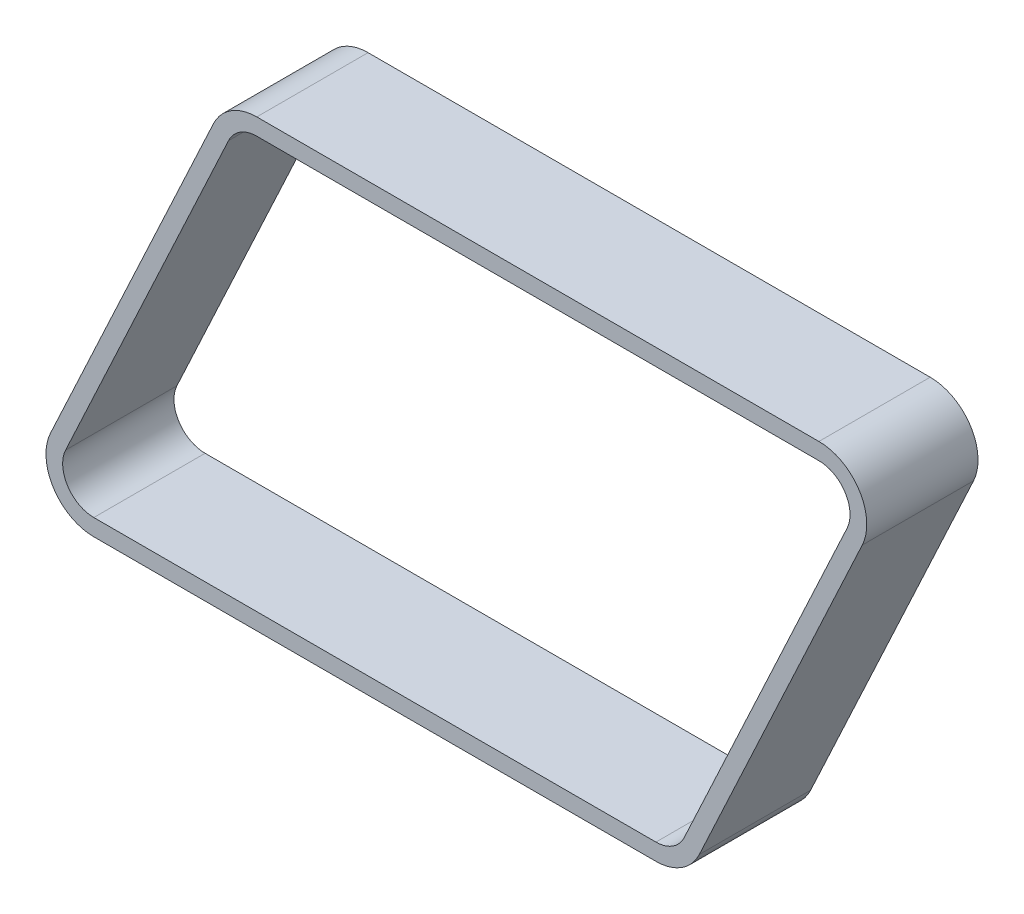
ISO-10303-21;
HEADER;
FILE_DESCRIPTION(('STEP AP214'),'2;1');
FILE_NAME('part.step','',(''),(''),'','','');
FILE_SCHEMA(('AUTOMOTIVE_DESIGN { 1 0 10303 214 1 1 1 1 }'));
ENDSEC;
DATA;
#1=APPLICATION_CONTEXT('core data for automotive mechanical design processes');
#2=APPLICATION_PROTOCOL_DEFINITION('international standard','automotive_design',2000,#1);
#3=PRODUCT_CONTEXT('',#1,'mechanical');
#4=PRODUCT('Part','Part','',(#3));
#5=PRODUCT_RELATED_PRODUCT_CATEGORY('part','',(#4));
#6=PRODUCT_DEFINITION_FORMATION('','',#4);
#7=PRODUCT_DEFINITION_CONTEXT('part definition',#1,'design');
#8=PRODUCT_DEFINITION('design','',#6,#7);
#9=PRODUCT_DEFINITION_SHAPE('','',#8);
#10=(LENGTH_UNIT() NAMED_UNIT(*) SI_UNIT(.MILLI.,.METRE.));
#11=(NAMED_UNIT(*) PLANE_ANGLE_UNIT() SI_UNIT($,.RADIAN.));
#12=(NAMED_UNIT(*) SI_UNIT($,.STERADIAN.) SOLID_ANGLE_UNIT());
#13=UNCERTAINTY_MEASURE_WITH_UNIT(LENGTH_MEASURE(1.E-05),#10,'distance_accuracy_value','');
#14=(GEOMETRIC_REPRESENTATION_CONTEXT(3) GLOBAL_UNCERTAINTY_ASSIGNED_CONTEXT((#13)) GLOBAL_UNIT_ASSIGNED_CONTEXT((#10,
#11,#12)) REPRESENTATION_CONTEXT('',''));
#15=CARTESIAN_POINT('',(0.,0.,0.));
#16=DIRECTION('',(0.,0.,1.));
#17=DIRECTION('',(1.,0.,0.));
#18=AXIS2_PLACEMENT_3D('',#15,#16,#17);
#19=CARTESIAN_POINT('',(0.,0.,10.));
#20=DIRECTION('',(0.,1.,0.));
#21=DIRECTION('',(0.,0.,1.));
#22=AXIS2_PLACEMENT_3D('',#19,#20,#21);
#23=PLANE('',#22);
#24=DIRECTION('',(1.,0.,0.));
#25=VECTOR('',#24,1.);
#26=CARTESIAN_POINT('',(0.,0.,0.));
#27=LINE('',#26,#25);
#28=CARTESIAN_POINT('',(6.74713156650308,0.,0.));
#29=VERTEX_POINT('',#28);
#30=CARTESIAN_POINT('',(57.2597719974312,0.,0.));
#31=VERTEX_POINT('',#30);
#32=EDGE_CURVE('E224',#29,#31,#27,.T.);
#33=ORIENTED_EDGE('',*,*,#32,.T.);
#34=DIRECTION('',(0.,0.,-1.));
#35=VECTOR('',#34,1.);
#36=CARTESIAN_POINT('',(57.2597719974312,0.,10.));
#37=LINE('',#36,#35);
#38=CARTESIAN_POINT('',(57.2597719974312,0.,10.));
#39=VERTEX_POINT('',#38);
#40=EDGE_CURVE('E11',#39,#31,#37,.T.);
#41=ORIENTED_EDGE('',*,*,#40,.F.);
#42=DIRECTION('',(1.,0.,0.));
#43=VECTOR('',#42,1.);
#44=CARTESIAN_POINT('',(0.,0.,10.));
#45=LINE('',#44,#43);
#46=CARTESIAN_POINT('',(6.74713156650308,0.,10.));
#47=VERTEX_POINT('',#46);
#48=EDGE_CURVE('E348',#47,#39,#45,.T.);
#49=ORIENTED_EDGE('',*,*,#48,.F.);
#50=DIRECTION('',(0.,0.,-1.));
#51=VECTOR('',#50,1.);
#52=CARTESIAN_POINT('',(6.74713156650308,0.,10.));
#53=LINE('',#52,#51);
#54=EDGE_CURVE('E250',#47,#29,#53,.T.);
#55=ORIENTED_EDGE('',*,*,#54,.T.);
#56=EDGE_LOOP('',(#33,#41,#49,#55));
#57=FACE_BOUND('',#56,.T.);
#58=ADVANCED_FACE('F41',(#57),#23,.F.);
#59=CARTESIAN_POINT('',(57.2597719974312,4.3012963736457,10.));
#60=DIRECTION('',(0.,0.,-1.));
#61=DIRECTION('',(-1.,0.,0.));
#62=AXIS2_PLACEMENT_3D('',#59,#60,#61);
#63=CYLINDRICAL_SURFACE('',#62,4.30129637364572);
#64=CARTESIAN_POINT('',(57.2597719974312,4.3012963736457,0.));
#65=DIRECTION('',(0.,0.,1.));
#66=DIRECTION('',(1.,0.,0.));
#67=AXIS2_PLACEMENT_3D('',#64,#65,#66);
#68=CIRCLE('',#67,4.30129637364572);
#69=CARTESIAN_POINT('',(61.1580703952188,2.48348997698398,0.));
#70=VERTEX_POINT('',#69);
#71=EDGE_CURVE('E228',#31,#70,#68,.T.);
#72=ORIENTED_EDGE('',*,*,#71,.T.);
#73=DIRECTION('',(0.,0.,-1.));
#74=VECTOR('',#73,1.);
#75=CARTESIAN_POINT('',(61.1580703952188,2.48348997698398,10.));
#76=LINE('',#75,#74);
#77=CARTESIAN_POINT('',(61.1580703952188,2.48348997698398,10.));
#78=VERTEX_POINT('',#77);
#79=EDGE_CURVE('E52',#78,#70,#76,.T.);
#80=ORIENTED_EDGE('',*,*,#79,.F.);
#81=CARTESIAN_POINT('',(57.2597719974312,4.3012963736457,10.));
#82=DIRECTION('',(0.,0.,1.));
#83=DIRECTION('',(1.,0.,0.));
#84=AXIS2_PLACEMENT_3D('',#81,#82,#83);
#85=CIRCLE('',#84,4.30129637364572);
#86=EDGE_CURVE('E351',#39,#78,#85,.T.);
#87=ORIENTED_EDGE('',*,*,#86,.F.);
#88=ORIENTED_EDGE('',*,*,#40,.T.);
#89=EDGE_LOOP('',(#72,#80,#87,#88));
#90=FACE_BOUND('',#89,.T.);
#91=ADVANCED_FACE('F382',(#90),#63,.T.);
#92=CARTESIAN_POINT('',(49.2836282905963,-22.9813332935693,10.));
#93=DIRECTION('',(-0.906307787036651,0.422618261740697,0.));
#94=DIRECTION('',(-0.422618261740697,-0.906307787036651,0.));
#95=AXIS2_PLACEMENT_3D('',#92,#93,#94);
#96=PLANE('',#95);
#97=DIRECTION('',(0.422618261740697,0.906307787036651,0.));
#98=VECTOR('',#97,1.);
#99=CARTESIAN_POINT('',(49.2836282905963,-22.9813332935693,0.));
#100=LINE('',#99,#98);
#101=CARTESIAN_POINT('',(75.8008453118285,33.8850221211175,0.));
#102=VERTEX_POINT('',#101);
#103=EDGE_CURVE('E231',#70,#102,#100,.T.);
#104=ORIENTED_EDGE('',*,*,#103,.T.);
#105=DIRECTION('',(0.,0.,-1.));
#106=VECTOR('',#105,1.);
#107=CARTESIAN_POINT('',(75.8008453118285,33.8850221211175,10.));
#108=LINE('',#107,#106);
#109=CARTESIAN_POINT('',(75.8008453118285,33.8850221211175,10.));
#110=VERTEX_POINT('',#109);
#111=EDGE_CURVE('E260',#110,#102,#108,.T.);
#112=ORIENTED_EDGE('',*,*,#111,.F.);
#113=DIRECTION('',(0.422618261740697,0.906307787036651,0.));
#114=VECTOR('',#113,1.);
#115=CARTESIAN_POINT('',(49.2836282905963,-22.9813332935693,10.));
#116=LINE('',#115,#114);
#117=EDGE_CURVE('E354',#78,#110,#116,.T.);
#118=ORIENTED_EDGE('',*,*,#117,.F.);
#119=ORIENTED_EDGE('',*,*,#79,.T.);
#120=EDGE_LOOP('',(#104,#112,#118,#119));
#121=FACE_BOUND('',#120,.T.);
#122=ADVANCED_FACE('F387',(#121),#96,.F.);
#123=CARTESIAN_POINT('',(71.9051747596968,35.7016031332254,10.));
#124=DIRECTION('',(0.,0.,-1.));
#125=DIRECTION('',(-1.,0.,0.));
#126=AXIS2_PLACEMENT_3D('',#123,#124,#125);
#127=CYLINDRICAL_SURFACE('',#126,4.2983968667746);
#128=CARTESIAN_POINT('',(71.9051747596968,35.7016031332254,0.));
#129=DIRECTION('',(0.,0.,1.));
#130=DIRECTION('',(1.,0.,0.));
#131=AXIS2_PLACEMENT_3D('',#128,#129,#130);
#132=CIRCLE('',#131,4.2983968667746);
#133=CARTESIAN_POINT('',(71.9051747596968,40.,0.));
#134=VERTEX_POINT('',#133);
#135=EDGE_CURVE('E234',#102,#134,#132,.T.);
#136=ORIENTED_EDGE('',*,*,#135,.T.);
#137=DIRECTION('',(0.,0.,-1.));
#138=VECTOR('',#137,1.);
#139=CARTESIAN_POINT('',(71.9051747596968,40.,10.));
#140=LINE('',#139,#138);
#141=CARTESIAN_POINT('',(71.9051747596968,40.,10.));
#142=VERTEX_POINT('',#141);
#143=EDGE_CURVE('E257',#142,#134,#140,.T.);
#144=ORIENTED_EDGE('',*,*,#143,.F.);
#145=CARTESIAN_POINT('',(71.9051747596968,35.7016031332254,10.));
#146=DIRECTION('',(0.,0.,1.));
#147=DIRECTION('',(1.,0.,0.));
#148=AXIS2_PLACEMENT_3D('',#145,#146,#147);
#149=CIRCLE('',#148,4.2983968667746);
#150=EDGE_CURVE('E357',#110,#142,#149,.T.);
#151=ORIENTED_EDGE('',*,*,#150,.F.);
#152=ORIENTED_EDGE('',*,*,#111,.T.);
#153=EDGE_LOOP('',(#136,#144,#151,#152));
#154=FACE_BOUND('',#153,.T.);
#155=ADVANCED_FACE('F415',(#154),#127,.T.);
#156=CARTESIAN_POINT('',(0.,40.,10.));
#157=DIRECTION('',(0.,1.,0.));
#158=DIRECTION('',(0.,0.,1.));
#159=AXIS2_PLACEMENT_3D('',#156,#157,#158);
#160=PLANE('',#159);
#161=DIRECTION('',(1.,0.,0.));
#162=VECTOR('',#161,1.);
#163=CARTESIAN_POINT('',(0.,40.,0.));
#164=LINE('',#163,#162);
#165=CARTESIAN_POINT('',(21.3925343287686,40.,0.));
#166=VERTEX_POINT('',#165);
#167=EDGE_CURVE('E238',#166,#134,#164,.T.);
#168=ORIENTED_EDGE('',*,*,#167,.F.);
#169=DIRECTION('',(0.,0.,-1.));
#170=VECTOR('',#169,1.);
#171=CARTESIAN_POINT('',(21.3925343287686,40.,10.));
#172=LINE('',#171,#170);
#173=CARTESIAN_POINT('',(21.3925343287686,40.,10.));
#174=VERTEX_POINT('',#173);
#175=EDGE_CURVE('E182',#174,#166,#172,.T.);
#176=ORIENTED_EDGE('',*,*,#175,.F.);
#177=DIRECTION('',(1.,0.,0.));
#178=VECTOR('',#177,1.);
#179=CARTESIAN_POINT('',(0.,40.,10.));
#180=LINE('',#179,#178);
#181=EDGE_CURVE('E169',#174,#142,#180,.T.);
#182=ORIENTED_EDGE('',*,*,#181,.T.);
#183=ORIENTED_EDGE('',*,*,#143,.T.);
#184=EDGE_LOOP('',(#168,#176,#182,#183));
#185=FACE_BOUND('',#184,.T.);
#186=ADVANCED_FACE('F362',(#185),#160,.T.);
#187=CARTESIAN_POINT('',(21.3925343287686,35.6987036263543,10.));
#188=DIRECTION('',(0.,0.,-1.));
#189=DIRECTION('',(-1.,0.,0.));
#190=AXIS2_PLACEMENT_3D('',#187,#188,#189);
#191=CYLINDRICAL_SURFACE('',#190,4.30129637364571);
#192=CARTESIAN_POINT('',(21.3925343287686,35.6987036263543,0.));
#193=DIRECTION('',(0.,0.,1.));
#194=DIRECTION('',(1.,0.,0.));
#195=AXIS2_PLACEMENT_3D('',#192,#193,#194);
#196=CIRCLE('',#195,4.30129637364571);
#197=CARTESIAN_POINT('',(17.494235930981,37.516510023016,0.));
#198=VERTEX_POINT('',#197);
#199=EDGE_CURVE('E177',#166,#198,#196,.T.);
#200=ORIENTED_EDGE('',*,*,#199,.T.);
#201=DIRECTION('',(0.,0.,-1.));
#202=VECTOR('',#201,1.);
#203=CARTESIAN_POINT('',(17.494235930981,37.516510023016,10.));
#204=LINE('',#203,#202);
#205=CARTESIAN_POINT('',(17.494235930981,37.516510023016,10.));
#206=VERTEX_POINT('',#205);
#207=EDGE_CURVE('E174',#206,#198,#204,.T.);
#208=ORIENTED_EDGE('',*,*,#207,.F.);
#209=CARTESIAN_POINT('',(21.3925343287686,35.6987036263543,10.));
#210=DIRECTION('',(0.,0.,1.));
#211=DIRECTION('',(1.,0.,0.));
#212=AXIS2_PLACEMENT_3D('',#209,#210,#211);
#213=CIRCLE('',#212,4.30129637364571);
#214=EDGE_CURVE('E163',#174,#206,#213,.T.);
#215=ORIENTED_EDGE('',*,*,#214,.F.);
#216=ORIENTED_EDGE('',*,*,#175,.T.);
#217=EDGE_LOOP('',(#200,#208,#215,#216));
#218=FACE_BOUND('',#217,.T.);
#219=ADVANCED_FACE('F175',(#218),#191,.T.);
#220=CARTESIAN_POINT('',(0.,0.,10.));
#221=DIRECTION('',(-0.906307787036651,0.422618261740697,0.));
#222=DIRECTION('',(-0.422618261740697,-0.906307787036651,0.));
#223=AXIS2_PLACEMENT_3D('',#220,#221,#222);
#224=PLANE('',#223);
#225=DIRECTION('',(0.422618261740697,0.906307787036651,0.));
#226=VECTOR('',#225,1.);
#227=CARTESIAN_POINT('',(0.,0.,0.));
#228=LINE('',#227,#226);
#229=CARTESIAN_POINT('',(2.85146101437132,6.11497787888254,0.));
#230=VERTEX_POINT('',#229);
#231=EDGE_CURVE('E244',#230,#198,#228,.T.);
#232=ORIENTED_EDGE('',*,*,#231,.F.);
#233=DIRECTION('',(0.,0.,-1.));
#234=VECTOR('',#233,1.);
#235=CARTESIAN_POINT('',(2.85146101437132,6.11497787888254,10.));
#236=LINE('',#235,#234);
#237=CARTESIAN_POINT('',(2.85146101437132,6.11497787888254,10.));
#238=VERTEX_POINT('',#237);
#239=EDGE_CURVE('E113',#238,#230,#236,.T.);
#240=ORIENTED_EDGE('',*,*,#239,.F.);
#241=DIRECTION('',(0.422618261740697,0.906307787036651,0.));
#242=VECTOR('',#241,1.);
#243=CARTESIAN_POINT('',(0.,0.,10.));
#244=LINE('',#243,#242);
#245=EDGE_CURVE('E167',#238,#206,#244,.T.);
#246=ORIENTED_EDGE('',*,*,#245,.T.);
#247=ORIENTED_EDGE('',*,*,#207,.T.);
#248=EDGE_LOOP('',(#232,#240,#246,#247));
#249=FACE_BOUND('',#248,.T.);
#250=ADVANCED_FACE('F184',(#249),#224,.T.);
#251=CARTESIAN_POINT('',(6.74713156650308,4.2983968667746,10.));
#252=DIRECTION('',(0.,0.,-1.));
#253=DIRECTION('',(-1.,0.,0.));
#254=AXIS2_PLACEMENT_3D('',#251,#252,#253);
#255=CYLINDRICAL_SURFACE('',#254,2.7983968667746);
#256=CARTESIAN_POINT('',(6.74713156650308,4.2983968667746,0.));
#257=DIRECTION('',(0.,0.,1.));
#258=DIRECTION('',(1.,0.,0.));
#259=AXIS2_PLACEMENT_3D('',#256,#257,#258);
#260=CIRCLE('',#259,2.7983968667746);
#261=CARTESIAN_POINT('',(4.21092269492629,5.48105048627149,0.));
#262=VERTEX_POINT('',#261);
#263=CARTESIAN_POINT('',(6.74713156650308,1.5,0.));
#264=VERTEX_POINT('',#263);
#265=EDGE_CURVE('E192',#262,#264,#260,.T.);
#266=ORIENTED_EDGE('',*,*,#265,.F.);
#267=DIRECTION('',(0.,0.,-1.));
#268=VECTOR('',#267,1.);
#269=CARTESIAN_POINT('',(4.21092269492629,5.48105048627149,10.));
#270=LINE('',#269,#268);
#271=CARTESIAN_POINT('',(4.21092269492629,5.48105048627149,10.));
#272=VERTEX_POINT('',#271);
#273=EDGE_CURVE('E45',#272,#262,#270,.T.);
#274=ORIENTED_EDGE('',*,*,#273,.F.);
#275=CARTESIAN_POINT('',(6.74713156650308,4.2983968667746,10.));
#276=DIRECTION('',(0.,0.,1.));
#277=DIRECTION('',(1.,0.,0.));
#278=AXIS2_PLACEMENT_3D('',#275,#276,#277);
#279=CIRCLE('',#278,2.7983968667746);
#280=CARTESIAN_POINT('',(6.74713156650308,1.5,10.));
#281=VERTEX_POINT('',#280);
#282=EDGE_CURVE('E249',#272,#281,#279,.T.);
#283=ORIENTED_EDGE('',*,*,#282,.T.);
#284=DIRECTION('',(0.,0.,-1.));
#285=VECTOR('',#284,1.);
#286=CARTESIAN_POINT('',(6.74713156650308,1.5,10.));
#287=LINE('',#286,#285);
#288=EDGE_CURVE('E188',#281,#264,#287,.T.);
#289=ORIENTED_EDGE('',*,*,#288,.T.);
#290=EDGE_LOOP('',(#266,#274,#283,#289));
#291=FACE_BOUND('',#290,.T.);
#292=ADVANCED_FACE('F43',(#291),#255,.F.);
#293=CARTESIAN_POINT('',(1.35946168055498,-0.633927392611046,10.));
#294=DIRECTION('',(-0.906307787036651,0.422618261740697,0.));
#295=DIRECTION('',(-0.422618261740697,-0.906307787036651,0.));
#296=AXIS2_PLACEMENT_3D('',#293,#294,#295);
#297=PLANE('',#296);
#298=DIRECTION('',(0.422618261740697,0.906307787036651,0.));
#299=VECTOR('',#298,1.);
#300=CARTESIAN_POINT('',(1.35946168055498,-0.633927392611046,0.));
#301=LINE('',#300,#299);
#302=CARTESIAN_POINT('',(18.853697611536,36.8825826304049,0.));
#303=VERTEX_POINT('',#302);
#304=EDGE_CURVE('E196',#262,#303,#301,.T.);
#305=ORIENTED_EDGE('',*,*,#304,.T.);
#306=DIRECTION('',(0.,0.,-1.));
#307=VECTOR('',#306,1.);
#308=CARTESIAN_POINT('',(18.853697611536,36.8825826304049,10.));
#309=LINE('',#308,#307);
#310=CARTESIAN_POINT('',(18.853697611536,36.8825826304049,10.));
#311=VERTEX_POINT('',#310);
#312=EDGE_CURVE('E283',#311,#303,#309,.T.);
#313=ORIENTED_EDGE('',*,*,#312,.F.);
#314=DIRECTION('',(0.422618261740697,0.906307787036651,0.));
#315=VECTOR('',#314,1.);
#316=CARTESIAN_POINT('',(1.35946168055498,-0.633927392611046,10.));
#317=LINE('',#316,#315);
#318=EDGE_CURVE('E293',#272,#311,#317,.T.);
#319=ORIENTED_EDGE('',*,*,#318,.F.);
#320=ORIENTED_EDGE('',*,*,#273,.T.);
#321=EDGE_LOOP('',(#305,#313,#319,#320));
#322=FACE_BOUND('',#321,.T.);
#323=ADVANCED_FACE('F292',(#322),#297,.F.);
#324=CARTESIAN_POINT('',(21.3925343287686,35.6987036263543,10.));
#325=DIRECTION('',(0.,0.,-1.));
#326=DIRECTION('',(-1.,0.,0.));
#327=AXIS2_PLACEMENT_3D('',#324,#325,#326);
#328=CYLINDRICAL_SURFACE('',#327,2.80129637364572);
#329=CARTESIAN_POINT('',(21.3925343287686,35.6987036263543,0.));
#330=DIRECTION('',(0.,0.,1.));
#331=DIRECTION('',(1.,0.,0.));
#332=AXIS2_PLACEMENT_3D('',#329,#330,#331);
#333=CIRCLE('',#332,2.80129637364572);
#334=CARTESIAN_POINT('',(21.3925343287686,38.5,0.));
#335=VERTEX_POINT('',#334);
#336=EDGE_CURVE('E200',#335,#303,#333,.T.);
#337=ORIENTED_EDGE('',*,*,#336,.F.);
#338=DIRECTION('',(0.,0.,-1.));
#339=VECTOR('',#338,1.);
#340=CARTESIAN_POINT('',(21.3925343287686,38.5,10.));
#341=LINE('',#340,#339);
#342=CARTESIAN_POINT('',(21.3925343287686,38.5,10.));
#343=VERTEX_POINT('',#342);
#344=EDGE_CURVE('E281',#343,#335,#341,.T.);
#345=ORIENTED_EDGE('',*,*,#344,.F.);
#346=CARTESIAN_POINT('',(21.3925343287686,35.6987036263543,10.));
#347=DIRECTION('',(0.,0.,1.));
#348=DIRECTION('',(1.,0.,0.));
#349=AXIS2_PLACEMENT_3D('',#346,#347,#348);
#350=CIRCLE('',#349,2.80129637364572);
#351=EDGE_CURVE('E327',#343,#311,#350,.T.);
#352=ORIENTED_EDGE('',*,*,#351,.T.);
#353=ORIENTED_EDGE('',*,*,#312,.T.);
#354=EDGE_LOOP('',(#337,#345,#352,#353));
#355=FACE_BOUND('',#354,.T.);
#356=ADVANCED_FACE('F324',(#355),#328,.F.);
#357=CARTESIAN_POINT('',(0.,38.5,10.));
#358=DIRECTION('',(0.,1.,0.));
#359=DIRECTION('',(-1.,0.,0.));
#360=AXIS2_PLACEMENT_3D('',#357,#358,#359);
#361=PLANE('',#360);
#362=DIRECTION('',(1.,0.,0.));
#363=VECTOR('',#362,1.);
#364=CARTESIAN_POINT('',(0.,38.5,0.));
#365=LINE('',#364,#363);
#366=CARTESIAN_POINT('',(71.9051747596968,38.5,0.));
#367=VERTEX_POINT('',#366);
#368=EDGE_CURVE('E204',#335,#367,#365,.T.);
#369=ORIENTED_EDGE('',*,*,#368,.T.);
#370=DIRECTION('',(0.,0.,-1.));
#371=VECTOR('',#370,1.);
#372=CARTESIAN_POINT('',(71.9051747596968,38.5,10.));
#373=LINE('',#372,#371);
#374=CARTESIAN_POINT('',(71.9051747596968,38.5,10.));
#375=VERTEX_POINT('',#374);
#376=EDGE_CURVE('E278',#375,#367,#373,.T.);
#377=ORIENTED_EDGE('',*,*,#376,.F.);
#378=DIRECTION('',(1.,0.,0.));
#379=VECTOR('',#378,1.);
#380=CARTESIAN_POINT('',(0.,38.5,10.));
#381=LINE('',#380,#379);
#382=EDGE_CURVE('E328',#343,#375,#381,.T.);
#383=ORIENTED_EDGE('',*,*,#382,.F.);
#384=ORIENTED_EDGE('',*,*,#344,.T.);
#385=EDGE_LOOP('',(#369,#377,#383,#384));
#386=FACE_BOUND('',#385,.T.);
#387=ADVANCED_FACE('F329',(#386),#361,.F.);
#388=CARTESIAN_POINT('',(71.9051747596968,35.7016031332254,10.));
#389=DIRECTION('',(0.,0.,-1.));
#390=DIRECTION('',(-1.,0.,0.));
#391=AXIS2_PLACEMENT_3D('',#388,#389,#390);
#392=CYLINDRICAL_SURFACE('',#391,2.79839686677457);
#393=CARTESIAN_POINT('',(71.9051747596968,35.7016031332254,0.));
#394=DIRECTION('',(0.,0.,1.));
#395=DIRECTION('',(1.,0.,0.));
#396=AXIS2_PLACEMENT_3D('',#393,#394,#395);
#397=CIRCLE('',#396,2.79839686677457);
#398=CARTESIAN_POINT('',(74.4413836312735,34.5189495137285,0.));
#399=VERTEX_POINT('',#398);
#400=EDGE_CURVE('E208',#399,#367,#397,.T.);
#401=ORIENTED_EDGE('',*,*,#400,.F.);
#402=DIRECTION('',(0.,0.,-1.));
#403=VECTOR('',#402,1.);
#404=CARTESIAN_POINT('',(74.4413836312735,34.5189495137285,10.));
#405=LINE('',#404,#403);
#406=CARTESIAN_POINT('',(74.4413836312735,34.5189495137285,10.));
#407=VERTEX_POINT('',#406);
#408=EDGE_CURVE('E275',#407,#399,#405,.T.);
#409=ORIENTED_EDGE('',*,*,#408,.F.);
#410=CARTESIAN_POINT('',(71.9051747596968,35.7016031332254,10.));
#411=DIRECTION('',(0.,0.,1.));
#412=DIRECTION('',(1.,0.,0.));
#413=AXIS2_PLACEMENT_3D('',#410,#411,#412);
#414=CIRCLE('',#413,2.79839686677457);
#415=EDGE_CURVE('E332',#407,#375,#414,.T.);
#416=ORIENTED_EDGE('',*,*,#415,.T.);
#417=ORIENTED_EDGE('',*,*,#376,.T.);
#418=EDGE_LOOP('',(#401,#409,#416,#417));
#419=FACE_BOUND('',#418,.T.);
#420=ADVANCED_FACE('F321',(#419),#392,.F.);
#421=CARTESIAN_POINT('',(47.9241666100413,-22.3474059009582,10.));
#422=DIRECTION('',(-0.906307787036651,0.422618261740698,0.));
#423=DIRECTION('',(-0.422618261740698,-0.906307787036651,0.));
#424=AXIS2_PLACEMENT_3D('',#421,#422,#423);
#425=PLANE('',#424);
#426=DIRECTION('',(0.422618261740698,0.906307787036651,0.));
#427=VECTOR('',#426,1.);
#428=CARTESIAN_POINT('',(47.9241666100413,-22.3474059009582,0.));
#429=LINE('',#428,#427);
#430=CARTESIAN_POINT('',(59.7986087146638,3.11741736959503,0.));
#431=VERTEX_POINT('',#430);
#432=EDGE_CURVE('E212',#431,#399,#429,.T.);
#433=ORIENTED_EDGE('',*,*,#432,.F.);
#434=DIRECTION('',(0.,0.,-1.));
#435=VECTOR('',#434,1.);
#436=CARTESIAN_POINT('',(59.7986087146638,3.11741736959503,10.));
#437=LINE('',#436,#435);
#438=CARTESIAN_POINT('',(59.7986087146638,3.11741736959503,10.));
#439=VERTEX_POINT('',#438);
#440=EDGE_CURVE('E272',#439,#431,#437,.T.);
#441=ORIENTED_EDGE('',*,*,#440,.F.);
#442=DIRECTION('',(0.422618261740698,0.906307787036651,0.));
#443=VECTOR('',#442,1.);
#444=CARTESIAN_POINT('',(47.9241666100413,-22.3474059009582,10.));
#445=LINE('',#444,#443);
#446=EDGE_CURVE('E317',#439,#407,#445,.T.);
#447=ORIENTED_EDGE('',*,*,#446,.T.);
#448=ORIENTED_EDGE('',*,*,#408,.T.);
#449=EDGE_LOOP('',(#433,#441,#447,#448));
#450=FACE_BOUND('',#449,.T.);
#451=ADVANCED_FACE('F315',(#450),#425,.T.);
#452=CARTESIAN_POINT('',(57.2597719974312,4.3012963736457,10.));
#453=DIRECTION('',(0.,0.,-1.));
#454=DIRECTION('',(-1.,0.,0.));
#455=AXIS2_PLACEMENT_3D('',#452,#453,#454);
#456=CYLINDRICAL_SURFACE('',#455,2.80129637364571);
#457=CARTESIAN_POINT('',(57.2597719974312,4.3012963736457,0.));
#458=DIRECTION('',(0.,0.,1.));
#459=DIRECTION('',(1.,0.,0.));
#460=AXIS2_PLACEMENT_3D('',#457,#458,#459);
#461=CIRCLE('',#460,2.80129637364571);
#462=CARTESIAN_POINT('',(57.2597719974312,1.5,0.));
#463=VERTEX_POINT('',#462);
#464=EDGE_CURVE('E216',#463,#431,#461,.T.);
#465=ORIENTED_EDGE('',*,*,#464,.F.);
#466=DIRECTION('',(0.,0.,-1.));
#467=VECTOR('',#466,1.);
#468=CARTESIAN_POINT('',(57.2597719974312,1.5,10.));
#469=LINE('',#468,#467);
#470=CARTESIAN_POINT('',(57.2597719974312,1.5,10.));
#471=VERTEX_POINT('',#470);
#472=EDGE_CURVE('E269',#471,#463,#469,.T.);
#473=ORIENTED_EDGE('',*,*,#472,.F.);
#474=CARTESIAN_POINT('',(57.2597719974312,4.3012963736457,10.));
#475=DIRECTION('',(0.,0.,1.));
#476=DIRECTION('',(1.,0.,0.));
#477=AXIS2_PLACEMENT_3D('',#474,#475,#476);
#478=CIRCLE('',#477,2.80129637364571);
#479=EDGE_CURVE('E311',#471,#439,#478,.T.);
#480=ORIENTED_EDGE('',*,*,#479,.T.);
#481=ORIENTED_EDGE('',*,*,#440,.T.);
#482=EDGE_LOOP('',(#465,#473,#480,#481));
#483=FACE_BOUND('',#482,.T.);
#484=ADVANCED_FACE('F308',(#483),#456,.F.);
#485=CARTESIAN_POINT('',(0.,1.5,10.));
#486=DIRECTION('',(0.,1.,0.));
#487=DIRECTION('',(0.,0.,1.));
#488=AXIS2_PLACEMENT_3D('',#485,#486,#487);
#489=PLANE('',#488);
#490=DIRECTION('',(1.,0.,0.));
#491=VECTOR('',#490,1.);
#492=CARTESIAN_POINT('',(0.,1.5,0.));
#493=LINE('',#492,#491);
#494=EDGE_CURVE('E220',#264,#463,#493,.T.);
#495=ORIENTED_EDGE('',*,*,#494,.F.);
#496=ORIENTED_EDGE('',*,*,#288,.F.);
#497=DIRECTION('',(1.,0.,0.));
#498=VECTOR('',#497,1.);
#499=CARTESIAN_POINT('',(0.,1.5,10.));
#500=LINE('',#499,#498);
#501=EDGE_CURVE('E304',#281,#471,#500,.T.);
#502=ORIENTED_EDGE('',*,*,#501,.T.);
#503=ORIENTED_EDGE('',*,*,#472,.T.);
#504=EDGE_LOOP('',(#495,#496,#502,#503));
#505=FACE_BOUND('',#504,.T.);
#506=ADVANCED_FACE('F303',(#505),#489,.T.);
#507=CARTESIAN_POINT('',(6.74713156650308,4.2983968667746,10.));
#508=DIRECTION('',(0.,0.,-1.));
#509=DIRECTION('',(-1.,0.,0.));
#510=AXIS2_PLACEMENT_3D('',#507,#508,#509);
#511=CYLINDRICAL_SURFACE('',#510,4.2983968667746);
#512=CARTESIAN_POINT('',(6.74713156650308,4.2983968667746,0.));
#513=DIRECTION('',(0.,0.,1.));
#514=DIRECTION('',(1.,0.,0.));
#515=AXIS2_PLACEMENT_3D('',#512,#513,#514);
#516=CIRCLE('',#515,4.2983968667746);
#517=EDGE_CURVE('E116',#230,#29,#516,.T.);
#518=ORIENTED_EDGE('',*,*,#517,.T.);
#519=ORIENTED_EDGE('',*,*,#54,.F.);
#520=CARTESIAN_POINT('',(6.74713156650308,4.2983968667746,10.));
#521=DIRECTION('',(0.,0.,1.));
#522=DIRECTION('',(1.,0.,0.));
#523=AXIS2_PLACEMENT_3D('',#520,#521,#522);
#524=CIRCLE('',#523,4.2983968667746);
#525=EDGE_CURVE('E61',#238,#47,#524,.T.);
#526=ORIENTED_EDGE('',*,*,#525,.F.);
#527=ORIENTED_EDGE('',*,*,#239,.T.);
#528=EDGE_LOOP('',(#518,#519,#526,#527));
#529=FACE_BOUND('',#528,.T.);
#530=ADVANCED_FACE('F370',(#529),#511,.T.);
#531=CARTESIAN_POINT('',(0.,0.,10.));
#532=DIRECTION('',(0.,0.,1.));
#533=DIRECTION('',(1.,0.,0.));
#534=AXIS2_PLACEMENT_3D('',#531,#532,#533);
#535=PLANE('',#534);
#536=ORIENTED_EDGE('',*,*,#282,.F.);
#537=ORIENTED_EDGE('',*,*,#318,.T.);
#538=ORIENTED_EDGE('',*,*,#351,.F.);
#539=ORIENTED_EDGE('',*,*,#382,.T.);
#540=ORIENTED_EDGE('',*,*,#415,.F.);
#541=ORIENTED_EDGE('',*,*,#446,.F.);
#542=ORIENTED_EDGE('',*,*,#479,.F.);
#543=ORIENTED_EDGE('',*,*,#501,.F.);
#544=EDGE_LOOP('',(#536,#537,#538,#539,#540,#541,#542,#543));
#545=FACE_BOUND('',#544,.T.);
#546=ORIENTED_EDGE('',*,*,#48,.T.);
#547=ORIENTED_EDGE('',*,*,#86,.T.);
#548=ORIENTED_EDGE('',*,*,#117,.T.);
#549=ORIENTED_EDGE('',*,*,#150,.T.);
#550=ORIENTED_EDGE('',*,*,#181,.F.);
#551=ORIENTED_EDGE('',*,*,#214,.T.);
#552=ORIENTED_EDGE('',*,*,#245,.F.);
#553=ORIENTED_EDGE('',*,*,#525,.T.);
#554=EDGE_LOOP('',(#546,#547,#548,#549,#550,#551,#552,#553));
#555=FACE_BOUND('',#554,.T.);
#556=ADVANCED_FACE('F165',(#545,#555),#535,.T.);
#557=CARTESIAN_POINT('',(0.,0.,0.));
#558=DIRECTION('',(0.,0.,1.));
#559=DIRECTION('',(1.,0.,0.));
#560=AXIS2_PLACEMENT_3D('',#557,#558,#559);
#561=PLANE('',#560);
#562=ORIENTED_EDGE('',*,*,#265,.T.);
#563=ORIENTED_EDGE('',*,*,#494,.T.);
#564=ORIENTED_EDGE('',*,*,#464,.T.);
#565=ORIENTED_EDGE('',*,*,#432,.T.);
#566=ORIENTED_EDGE('',*,*,#400,.T.);
#567=ORIENTED_EDGE('',*,*,#368,.F.);
#568=ORIENTED_EDGE('',*,*,#336,.T.);
#569=ORIENTED_EDGE('',*,*,#304,.F.);
#570=EDGE_LOOP('',(#562,#563,#564,#565,#566,#567,#568,#569));
#571=FACE_BOUND('',#570,.T.);
#572=ORIENTED_EDGE('',*,*,#32,.F.);
#573=ORIENTED_EDGE('',*,*,#517,.F.);
#574=ORIENTED_EDGE('',*,*,#231,.T.);
#575=ORIENTED_EDGE('',*,*,#199,.F.);
#576=ORIENTED_EDGE('',*,*,#167,.T.);
#577=ORIENTED_EDGE('',*,*,#135,.F.);
#578=ORIENTED_EDGE('',*,*,#103,.F.);
#579=ORIENTED_EDGE('',*,*,#71,.F.);
#580=EDGE_LOOP('',(#572,#573,#574,#575,#576,#577,#578,#579));
#581=FACE_BOUND('',#580,.T.);
#582=ADVANCED_FACE('F296',(#571,#581),#561,.F.);
#583=CLOSED_SHELL('',(#58,#91,#122,#155,#186,#219,#250,#292,#323,#356,#387,#420,#451,#484,#506,
#530,#556,#582));
#584=MANIFOLD_SOLID_BREP('B2',#583);
#585=ADVANCED_BREP_SHAPE_REPRESENTATION('',(#18,#584),#14);
#586=SHAPE_DEFINITION_REPRESENTATION(#9,#585);
ENDSEC;
END-ISO-10303-21;
